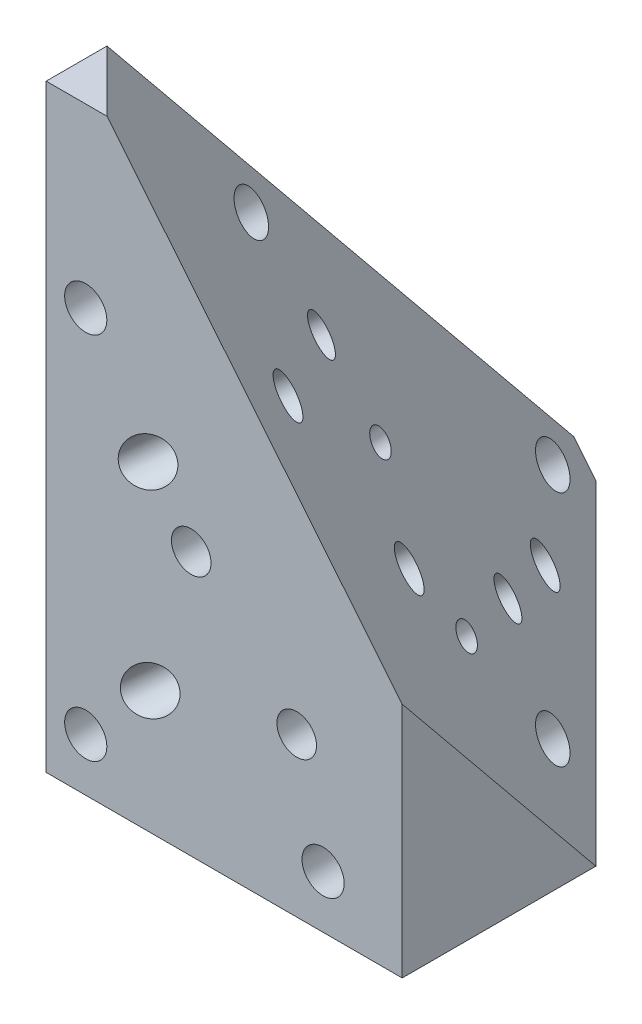
ISO-10303-21;
HEADER;
FILE_DESCRIPTION(('STEP AP214'),'2;1');
FILE_NAME('part.step','',(''),(''),'','','');
FILE_SCHEMA(('AUTOMOTIVE_DESIGN { 1 0 10303 214 1 1 1 1 }'));
ENDSEC;
DATA;
#1=APPLICATION_CONTEXT('core data for automotive mechanical design processes');
#2=APPLICATION_PROTOCOL_DEFINITION('international standard','automotive_design',2000,#1);
#3=PRODUCT_CONTEXT('',#1,'mechanical');
#4=PRODUCT('Part','Part','',(#3));
#5=PRODUCT_RELATED_PRODUCT_CATEGORY('part','',(#4));
#6=PRODUCT_DEFINITION_FORMATION('','',#4);
#7=PRODUCT_DEFINITION_CONTEXT('part definition',#1,'design');
#8=PRODUCT_DEFINITION('design','',#6,#7);
#9=PRODUCT_DEFINITION_SHAPE('','',#8);
#10=(LENGTH_UNIT() NAMED_UNIT(*) SI_UNIT(.MILLI.,.METRE.));
#11=(NAMED_UNIT(*) PLANE_ANGLE_UNIT() SI_UNIT($,.RADIAN.));
#12=(NAMED_UNIT(*) SI_UNIT($,.STERADIAN.) SOLID_ANGLE_UNIT());
#13=UNCERTAINTY_MEASURE_WITH_UNIT(LENGTH_MEASURE(1.E-05),#10,'distance_accuracy_value','');
#14=(GEOMETRIC_REPRESENTATION_CONTEXT(3) GLOBAL_UNCERTAINTY_ASSIGNED_CONTEXT((#13)) GLOBAL_UNIT_ASSIGNED_CONTEXT((#10,
#11,#12)) REPRESENTATION_CONTEXT('',''));
#15=CARTESIAN_POINT('',(0.,0.,0.));
#16=DIRECTION('',(0.,0.,1.));
#17=DIRECTION('',(1.,0.,0.));
#18=AXIS2_PLACEMENT_3D('',#15,#16,#17);
#19=CARTESIAN_POINT('',(13.5,22.7,0.));
#20=DIRECTION('',(0.,0.,-1.));
#21=DIRECTION('',(-1.,0.,0.));
#22=AXIS2_PLACEMENT_3D('',#19,#20,#21);
#23=PLANE('',#22);
#24=CARTESIAN_POINT('',(5.49999999999991,9.99999999999996,0.));
#25=DIRECTION('',(0.,0.,1.));
#26=DIRECTION('',(1.,0.,0.));
#27=AXIS2_PLACEMENT_3D('',#24,#25,#26);
#28=CIRCLE('',#27,0.749999999999989);
#29=CARTESIAN_POINT('',(6.2499999999999,9.99999999999996,0.));
#30=VERTEX_POINT('',#29);
#31=EDGE_CURVE('E155',#30,#30,#28,.T.);
#32=ORIENTED_EDGE('',*,*,#31,.F.);
#33=EDGE_LOOP('',(#32));
#34=FACE_BOUND('',#33,.T.);
#35=CARTESIAN_POINT('',(9.49999999999991,5.99999999999996,0.));
#36=DIRECTION('',(0.,0.,1.));
#37=DIRECTION('',(1.,0.,0.));
#38=AXIS2_PLACEMENT_3D('',#35,#36,#37);
#39=CIRCLE('',#38,0.749999999999989);
#40=CARTESIAN_POINT('',(10.2499999999999,5.99999999999996,0.));
#41=VERTEX_POINT('',#40);
#42=EDGE_CURVE('E133',#41,#41,#39,.T.);
#43=ORIENTED_EDGE('',*,*,#42,.F.);
#44=EDGE_LOOP('',(#43));
#45=FACE_BOUND('',#44,.T.);
#46=CARTESIAN_POINT('',(1.50000000000003,16.,0.));
#47=DIRECTION('',(0.,0.,1.));
#48=DIRECTION('',(1.,0.,0.));
#49=AXIS2_PLACEMENT_3D('',#46,#47,#48);
#50=CIRCLE('',#49,0.799999999999988);
#51=CARTESIAN_POINT('',(2.30000000000002,16.,0.));
#52=VERTEX_POINT('',#51);
#53=EDGE_CURVE('E120',#52,#52,#50,.T.);
#54=ORIENTED_EDGE('',*,*,#53,.F.);
#55=EDGE_LOOP('',(#54));
#56=FACE_BOUND('',#55,.T.);
#57=CARTESIAN_POINT('',(1.50000000000003,1.99999999999996,0.));
#58=DIRECTION('',(0.,0.,1.));
#59=DIRECTION('',(1.,0.,0.));
#60=AXIS2_PLACEMENT_3D('',#57,#58,#59);
#61=CIRCLE('',#60,0.799999999999988);
#62=CARTESIAN_POINT('',(2.30000000000002,1.99999999999996,0.));
#63=VERTEX_POINT('',#62);
#64=EDGE_CURVE('E119',#63,#63,#61,.T.);
#65=ORIENTED_EDGE('',*,*,#64,.F.);
#66=EDGE_LOOP('',(#65));
#67=FACE_BOUND('',#66,.T.);
#68=CARTESIAN_POINT('',(10.5,1.99999999999996,0.));
#69=DIRECTION('',(0.,0.,1.));
#70=DIRECTION('',(1.,0.,0.));
#71=AXIS2_PLACEMENT_3D('',#68,#69,#70);
#72=CIRCLE('',#71,0.799999999999988);
#73=CARTESIAN_POINT('',(11.3,1.99999999999996,0.));
#74=VERTEX_POINT('',#73);
#75=EDGE_CURVE('E171',#74,#74,#72,.T.);
#76=ORIENTED_EDGE('',*,*,#75,.F.);
#77=EDGE_LOOP('',(#76));
#78=FACE_BOUND('',#77,.T.);
#79=CARTESIAN_POINT('',(3.86275861430789,12.1280830884135,0.));
#80=DIRECTION('',(0.,0.,-1.));
#81=DIRECTION('',(0.774596669241479,0.632455532033681,0.));
#82=AXIS2_PLACEMENT_3D('',#79,#80,#81);
#83=ELLIPSE('',#82,1.30639452948435,0.799999999999993);
#84=CARTESIAN_POINT('',(4.87468746556176,12.9543195356044,0.));
#85=VERTEX_POINT('',#84);
#86=EDGE_CURVE('E180',#85,#85,#83,.T.);
#87=ORIENTED_EDGE('',*,*,#86,.T.);
#88=EDGE_LOOP('',(#87));
#89=FACE_BOUND('',#88,.T.);
#90=CARTESIAN_POINT('',(3.94544456856491,4.65658963492716,0.));
#91=DIRECTION('',(0.,0.,-1.));
#92=DIRECTION('',(0.774596669241479,0.632455532033681,0.));
#93=AXIS2_PLACEMENT_3D('',#90,#91,#92);
#94=ELLIPSE('',#93,1.30639452948435,0.799999999999992);
#95=CARTESIAN_POINT('',(4.95737341981878,5.48282608211808,0.));
#96=VERTEX_POINT('',#95);
#97=EDGE_CURVE('E186',#96,#96,#94,.T.);
#98=ORIENTED_EDGE('',*,*,#97,.T.);
#99=EDGE_LOOP('',(#98));
#100=FACE_BOUND('',#99,.T.);
#101=DIRECTION('',(0.,-1.,0.));
#102=VECTOR('',#101,1.);
#103=CARTESIAN_POINT('',(13.5,22.7,0.));
#104=LINE('',#103,#102);
#105=CARTESIAN_POINT('',(13.5,8.99101852486634,0.));
#106=VERTEX_POINT('',#105);
#107=CARTESIAN_POINT('',(13.5,0.,0.));
#108=VERTEX_POINT('',#107);
#109=EDGE_CURVE('E47',#106,#108,#104,.T.);
#110=ORIENTED_EDGE('',*,*,#109,.F.);
#111=DIRECTION('',(-0.632455532033681,0.774596669241479,0.));
#112=VECTOR('',#111,1.);
#113=CARTESIAN_POINT('',(6.78399809853108,17.2164074099464,0.));
#114=LINE('',#113,#112);
#115=CARTESIAN_POINT('',(2.30666349755168,22.7,0.));
#116=VERTEX_POINT('',#115);
#117=EDGE_CURVE('E193',#106,#116,#114,.T.);
#118=ORIENTED_EDGE('',*,*,#117,.T.);
#119=DIRECTION('',(1.,0.,0.));
#120=VECTOR('',#119,1.);
#121=CARTESIAN_POINT('',(13.5,22.7,0.));
#122=LINE('',#121,#120);
#123=CARTESIAN_POINT('',(0.,22.7,0.));
#124=VERTEX_POINT('',#123);
#125=EDGE_CURVE('E105',#124,#116,#122,.T.);
#126=ORIENTED_EDGE('',*,*,#125,.F.);
#127=DIRECTION('',(0.,-1.,0.));
#128=VECTOR('',#127,1.);
#129=CARTESIAN_POINT('',(0.,22.7,0.));
#130=LINE('',#129,#128);
#131=CARTESIAN_POINT('',(0.,0.,0.));
#132=VERTEX_POINT('',#131);
#133=EDGE_CURVE('E89',#124,#132,#130,.T.);
#134=ORIENTED_EDGE('',*,*,#133,.T.);
#135=DIRECTION('',(1.,0.,0.));
#136=VECTOR('',#135,1.);
#137=CARTESIAN_POINT('',(13.5,0.,0.));
#138=LINE('',#137,#136);
#139=EDGE_CURVE('E104',#132,#108,#138,.T.);
#140=ORIENTED_EDGE('',*,*,#139,.T.);
#141=EDGE_LOOP('',(#110,#118,#126,#134,#140));
#142=FACE_BOUND('',#141,.T.);
#143=ADVANCED_FACE('F39',(#34,#45,#56,#67,#78,#89,#100,#142),#23,.F.);
#144=CARTESIAN_POINT('',(13.5,22.7,-20.));
#145=DIRECTION('',(-1.,0.,0.));
#146=DIRECTION('',(0.,0.,1.));
#147=AXIS2_PLACEMENT_3D('',#144,#145,#146);
#148=PLANE('',#147);
#149=DIRECTION('',(0.,0.,-1.));
#150=VECTOR('',#149,1.);
#151=CARTESIAN_POINT('',(13.5,0.,-20.));
#152=LINE('',#151,#150);
#153=CARTESIAN_POINT('',(13.5,0.,-7.34113588461129));
#154=VERTEX_POINT('',#153);
#155=EDGE_CURVE('E98',#108,#154,#152,.T.);
#156=ORIENTED_EDGE('',*,*,#155,.T.);
#157=DIRECTION('',(0.,0.77459666924148,0.63245553203368));
#158=VECTOR('',#157,1.);
#159=CARTESIAN_POINT('',(13.5,7.41844843881372,-1.2839980985312));
#160=LINE('',#159,#158);
#161=EDGE_CURVE('E54',#154,#106,#160,.T.);
#162=ORIENTED_EDGE('',*,*,#161,.T.);
#163=ORIENTED_EDGE('',*,*,#109,.T.);
#164=EDGE_LOOP('',(#156,#162,#163));
#165=FACE_BOUND('',#164,.T.);
#166=ADVANCED_FACE('F202',(#165),#148,.F.);
#167=CARTESIAN_POINT('',(0.,22.7,-20.));
#168=DIRECTION('',(0.,0.,1.));
#169=DIRECTION('',(1.,0.,0.));
#170=AXIS2_PLACEMENT_3D('',#167,#168,#169);
#171=PLANE('',#170);
#172=DIRECTION('',(0.,-1.,0.));
#173=VECTOR('',#172,1.);
#174=CARTESIAN_POINT('',(0.,22.7,-20.));
#175=LINE('',#174,#173);
#176=CARTESIAN_POINT('',(0.,1.03017686082109,-20.));
#177=VERTEX_POINT('',#176);
#178=CARTESIAN_POINT('',(0.,0.,-20.));
#179=VERTEX_POINT('',#178);
#180=EDGE_CURVE('E78',#177,#179,#175,.T.);
#181=ORIENTED_EDGE('',*,*,#180,.F.);
#182=DIRECTION('',(0.632455532033681,-0.774596669241479,0.));
#183=VECTOR('',#182,1.);
#184=CARTESIAN_POINT('',(-10.6160019014689,14.0320707443283,-20.));
#185=LINE('',#184,#183);
#186=CARTESIAN_POINT('',(0.841135884611283,0.,-20.));
#187=VERTEX_POINT('',#186);
#188=EDGE_CURVE('E96',#177,#187,#185,.T.);
#189=ORIENTED_EDGE('',*,*,#188,.T.);
#190=DIRECTION('',(-1.,0.,0.));
#191=VECTOR('',#190,1.);
#192=CARTESIAN_POINT('',(0.,0.,-20.));
#193=LINE('',#192,#191);
#194=EDGE_CURVE('E92',#187,#179,#193,.T.);
#195=ORIENTED_EDGE('',*,*,#194,.T.);
#196=EDGE_LOOP('',(#181,#189,#195));
#197=FACE_BOUND('',#196,.T.);
#198=ADVANCED_FACE('F93',(#197),#171,.F.);
#199=CARTESIAN_POINT('',(0.,22.7,0.));
#200=DIRECTION('',(1.,0.,0.));
#201=DIRECTION('',(0.,0.,-1.));
#202=AXIS2_PLACEMENT_3D('',#199,#200,#201);
#203=PLANE('',#202);
#204=CARTESIAN_POINT('',(0.,9.80785732702183,-3.25126265847081));
#205=DIRECTION('',(1.,0.,0.));
#206=DIRECTION('',(0.,0.63245553203368,-0.77459666924148));
#207=AXIS2_PLACEMENT_3D('',#204,#205,#206);
#208=ELLIPSE('',#207,0.816496580927723,0.499999999999996);
#209=CARTESIAN_POINT('',(0.,10.3242551065162,-3.88371819050448));
#210=VERTEX_POINT('',#209);
#211=EDGE_CURVE('E137',#210,#210,#208,.T.);
#212=ORIENTED_EDGE('',*,*,#211,.T.);
#213=EDGE_LOOP('',(#212));
#214=FACE_BOUND('',#213,.T.);
#215=DIRECTION('',(0.,0.,1.));
#216=VECTOR('',#215,1.);
#217=CARTESIAN_POINT('',(0.,22.7,0.));
#218=LINE('',#217,#216);
#219=CARTESIAN_POINT('',(0.,22.7,-2.30666349755168));
#220=VERTEX_POINT('',#219);
#221=EDGE_CURVE('E63',#220,#124,#218,.T.);
#222=ORIENTED_EDGE('',*,*,#221,.F.);
#223=DIRECTION('',(0.,-0.77459666924148,-0.63245553203368));
#224=VECTOR('',#223,1.);
#225=CARTESIAN_POINT('',(0.,23.830029715461,-1.38399809853099));
#226=LINE('',#225,#224);
#227=EDGE_CURVE('E86',#220,#177,#226,.T.);
#228=ORIENTED_EDGE('',*,*,#227,.T.);
#229=ORIENTED_EDGE('',*,*,#180,.T.);
#230=DIRECTION('',(0.,0.,1.));
#231=VECTOR('',#230,1.);
#232=CARTESIAN_POINT('',(0.,0.,0.));
#233=LINE('',#232,#231);
#234=EDGE_CURVE('E82',#179,#132,#233,.T.);
#235=ORIENTED_EDGE('',*,*,#234,.T.);
#236=ORIENTED_EDGE('',*,*,#133,.F.);
#237=EDGE_LOOP('',(#222,#228,#229,#235,#236));
#238=FACE_BOUND('',#237,.T.);
#239=ADVANCED_FACE('F80',(#214,#238),#203,.F.);
#240=CARTESIAN_POINT('',(0.,22.7,0.));
#241=DIRECTION('',(0.,-1.,0.));
#242=DIRECTION('',(0.,0.,-1.));
#243=AXIS2_PLACEMENT_3D('',#240,#241,#242);
#244=PLANE('',#243);
#245=ORIENTED_EDGE('',*,*,#125,.T.);
#246=DIRECTION('',(-0.707106781186548,0.,-0.707106781186547));
#247=VECTOR('',#246,1.);
#248=CARTESIAN_POINT('',(1.15333174877584,22.7,-1.15333174877584));
#249=LINE('',#248,#247);
#250=EDGE_CURVE('E196',#116,#220,#249,.T.);
#251=ORIENTED_EDGE('',*,*,#250,.T.);
#252=ORIENTED_EDGE('',*,*,#221,.T.);
#253=EDGE_LOOP('',(#245,#251,#252));
#254=FACE_BOUND('',#253,.T.);
#255=ADVANCED_FACE('F224',(#254),#244,.F.);
#256=CARTESIAN_POINT('',(0.,0.,0.));
#257=DIRECTION('',(0.,-1.,0.));
#258=DIRECTION('',(0.,0.,-1.));
#259=AXIS2_PLACEMENT_3D('',#256,#257,#258);
#260=PLANE('',#259);
#261=CARTESIAN_POINT('',(2.13001266312057,0.,-5.38127532159136));
#262=DIRECTION('',(0.,-1.,0.));
#263=DIRECTION('',(0.707106781186547,0.,-0.707106781186548));
#264=AXIS2_PLACEMENT_3D('',#261,#262,#263);
#265=ELLIPSE('',#264,0.999999999999983,0.499999999999996);
#266=CARTESIAN_POINT('',(2.8371194443071,0.,-6.0883821027779));
#267=VERTEX_POINT('',#266);
#268=EDGE_CURVE('E142',#267,#267,#265,.T.);
#269=ORIENTED_EDGE('',*,*,#268,.F.);
#270=EDGE_LOOP('',(#269));
#271=FACE_BOUND('',#270,.T.);
#272=CARTESIAN_POINT('',(2.13001266312054,0.,-11.0381295710837));
#273=DIRECTION('',(0.,-1.,0.));
#274=DIRECTION('',(0.707106781186547,0.,-0.707106781186548));
#275=AXIS2_PLACEMENT_3D('',#272,#273,#274);
#276=ELLIPSE('',#275,1.59999999999997,0.799999999999993);
#277=CARTESIAN_POINT('',(3.26138351301899,0.,-12.1695004209822));
#278=VERTEX_POINT('',#277);
#279=EDGE_CURVE('E112',#278,#278,#276,.T.);
#280=ORIENTED_EDGE('',*,*,#279,.F.);
#281=EDGE_LOOP('',(#280));
#282=FACE_BOUND('',#281,.T.);
#283=DIRECTION('',(-0.707106781186548,0.,-0.707106781186547));
#284=VECTOR('',#283,1.);
#285=CARTESIAN_POINT('',(10.4205679423056,0.,-10.4205679423057));
#286=LINE('',#285,#284);
#287=EDGE_CURVE('E11',#154,#187,#286,.T.);
#288=ORIENTED_EDGE('',*,*,#287,.F.);
#289=ORIENTED_EDGE('',*,*,#155,.F.);
#290=ORIENTED_EDGE('',*,*,#139,.F.);
#291=ORIENTED_EDGE('',*,*,#234,.F.);
#292=ORIENTED_EDGE('',*,*,#194,.F.);
#293=EDGE_LOOP('',(#288,#289,#290,#291,#292));
#294=FACE_BOUND('',#293,.T.);
#295=ADVANCED_FACE('F101',(#271,#282,#294),#260,.T.);
#296=CARTESIAN_POINT('',(7.81542595672918,6.38126857216326,-7.81542595672919));
#297=DIRECTION('',(-0.612372435695792,-0.500000000000005,0.612372435695793));
#298=DIRECTION('',(0.707106781186548,0.,0.707106781186547));
#299=AXIS2_PLACEMENT_3D('',#296,#297,#298);
#300=PLANE('',#299);
#301=CARTESIAN_POINT('',(3.59317171965002,12.7416697508023,-6.84443437812084));
#302=DIRECTION('',(0.612372435695792,0.500000000000005,-0.612372435695793));
#303=DIRECTION('',(-0.707106781186548,0.,-0.707106781186547));
#304=AXIS2_PLACEMENT_3D('',#301,#302,#303);
#305=CIRCLE('',#304,0.749999999999988);
#306=CARTESIAN_POINT('',(3.06284163376012,12.7416697508023,-7.37476446401074));
#307=VERTEX_POINT('',#306);
#308=EDGE_CURVE('E323',#307,#307,#305,.T.);
#309=ORIENTED_EDGE('',*,*,#308,.F.);
#310=EDGE_LOOP('',(#309));
#311=FACE_BOUND('',#310,.T.);
#312=CARTESIAN_POINT('',(7.1287056255828,4.08141571295795,-10.3799682840536));
#313=DIRECTION('',(0.612372435695792,0.500000000000005,-0.612372435695793));
#314=DIRECTION('',(-0.707106781186548,0.,-0.707106781186547));
#315=AXIS2_PLACEMENT_3D('',#312,#313,#314);
#316=CIRCLE('',#315,0.749999999999989);
#317=CARTESIAN_POINT('',(6.5983755396929,4.08141571295795,-10.9102983699435));
#318=VERTEX_POINT('',#317);
#319=EDGE_CURVE('E145',#318,#318,#316,.T.);
#320=ORIENTED_EDGE('',*,*,#319,.F.);
#321=EDGE_LOOP('',(#320));
#322=FACE_BOUND('',#321,.T.);
#323=CARTESIAN_POINT('',(5.49999999999991,9.99999999999996,-7.17617007533406));
#324=DIRECTION('',(-0.612372435695792,-0.500000000000005,0.612372435695793));
#325=DIRECTION('',(0.474341649025253,0.387298334620744,0.790569415042096));
#326=AXIS2_PLACEMENT_3D('',#323,#324,#325);
#327=ELLIPSE('',#326,0.816496580927722,0.499999999999996);
#328=CARTESIAN_POINT('',(5.88729833462065,10.3162277660168,-6.53067285096616));
#329=VERTEX_POINT('',#328);
#330=EDGE_CURVE('E124',#329,#329,#327,.T.);
#331=ORIENTED_EDGE('',*,*,#330,.T.);
#332=EDGE_LOOP('',(#331));
#333=FACE_BOUND('',#332,.T.);
#334=CARTESIAN_POINT('',(9.49999999999991,5.99999999999996,-6.442156399045));
#335=DIRECTION('',(-0.612372435695792,-0.500000000000005,0.612372435695793));
#336=DIRECTION('',(0.474341649025253,0.387298334620744,0.790569415042096));
#337=AXIS2_PLACEMENT_3D('',#334,#335,#336);
#338=ELLIPSE('',#337,0.816496580927722,0.499999999999996);
#339=CARTESIAN_POINT('',(9.88729833462065,6.3162277660168,-5.7966591746771));
#340=VERTEX_POINT('',#339);
#341=EDGE_CURVE('E121',#340,#340,#338,.T.);
#342=ORIENTED_EDGE('',*,*,#341,.T.);
#343=EDGE_LOOP('',(#342));
#344=FACE_BOUND('',#343,.T.);
#345=CARTESIAN_POINT('',(1.50000000000003,16.,-6.27719058976751));
#346=DIRECTION('',(-0.612372435695792,-0.500000000000005,0.612372435695793));
#347=DIRECTION('',(0.474341649025253,0.387298334620744,0.790569415042096));
#348=AXIS2_PLACEMENT_3D('',#345,#346,#347);
#349=ELLIPSE('',#348,1.30639452948434,0.799999999999987);
#350=CARTESIAN_POINT('',(2.1196773353932,16.5059644256269,-5.24439503077888));
#351=VERTEX_POINT('',#350);
#352=EDGE_CURVE('E116',#351,#351,#349,.T.);
#353=ORIENTED_EDGE('',*,*,#352,.T.);
#354=EDGE_LOOP('',(#353));
#355=FACE_BOUND('',#354,.T.);
#356=CARTESIAN_POINT('',(1.50000000000003,1.99999999999996,-17.7081427227558));
#357=DIRECTION('',(-0.612372435695792,-0.500000000000005,0.612372435695793));
#358=DIRECTION('',(0.474341649025253,0.387298334620744,0.790569415042096));
#359=AXIS2_PLACEMENT_3D('',#356,#357,#358);
#360=ELLIPSE('',#359,1.30639452948434,0.799999999999987);
#361=CARTESIAN_POINT('',(2.1196773353932,2.5059644256269,-16.6753471637672));
#362=VERTEX_POINT('',#361);
#363=EDGE_CURVE('E168',#362,#362,#360,.T.);
#364=ORIENTED_EDGE('',*,*,#363,.T.);
#365=EDGE_LOOP('',(#364));
#366=FACE_BOUND('',#365,.T.);
#367=CARTESIAN_POINT('',(10.5,1.99999999999996,-8.70814272275583));
#368=DIRECTION('',(-0.612372435695792,-0.500000000000005,0.612372435695793));
#369=DIRECTION('',(0.474341649025253,0.387298334620744,0.790569415042096));
#370=AXIS2_PLACEMENT_3D('',#367,#368,#369);
#371=ELLIPSE('',#370,1.30639452948434,0.799999999999987);
#372=CARTESIAN_POINT('',(11.1196773353932,2.5059644256269,-7.67534716376719));
#373=VERTEX_POINT('',#372);
#374=EDGE_CURVE('E174',#373,#373,#371,.T.);
#375=ORIENTED_EDGE('',*,*,#374,.T.);
#376=EDGE_LOOP('',(#375));
#377=FACE_BOUND('',#376,.T.);
#378=CARTESIAN_POINT('',(6.51619820008524,14.294607437899,-2.65343958577735));
#379=DIRECTION('',(0.612372435695792,0.500000000000005,-0.612372435695793));
#380=DIRECTION('',(-0.707106781186548,0.,-0.707106781186547));
#381=AXIS2_PLACEMENT_3D('',#378,#379,#380);
#382=CIRCLE('',#381,0.799999999999988);
#383=CARTESIAN_POINT('',(5.95051277513601,14.294607437899,-3.21912501072658));
#384=VERTEX_POINT('',#383);
#385=EDGE_CURVE('E177',#384,#384,#382,.T.);
#386=ORIENTED_EDGE('',*,*,#385,.F.);
#387=EDGE_LOOP('',(#386));
#388=FACE_BOUND('',#387,.T.);
#389=CARTESIAN_POINT('',(8.85554524369419,8.66567004818119,-4.91010067512928));
#390=DIRECTION('',(0.612372435695792,0.500000000000005,-0.612372435695793));
#391=DIRECTION('',(-0.707106781186548,0.,-0.707106781186547));
#392=AXIS2_PLACEMENT_3D('',#389,#390,#391);
#393=CIRCLE('',#392,0.799999999999988);
#394=CARTESIAN_POINT('',(8.28985981874496,8.66567004818119,-5.47578610007851));
#395=VERTEX_POINT('',#394);
#396=EDGE_CURVE('E183',#395,#395,#393,.T.);
#397=ORIENTED_EDGE('',*,*,#396,.F.);
#398=EDGE_LOOP('',(#397));
#399=FACE_BOUND('',#398,.T.);
#400=CARTESIAN_POINT('',(5.00738528202316,2.34936490538908,-13.9155021899863));
#401=DIRECTION('',(0.612372435695792,0.500000000000005,-0.612372435695793));
#402=DIRECTION('',(-0.707106781186548,0.,-0.707106781186547));
#403=AXIS2_PLACEMENT_3D('',#400,#401,#402);
#404=CIRCLE('',#403,0.799999999999988);
#405=CARTESIAN_POINT('',(4.44169985707393,2.34936490538908,-14.4811876149356));
#406=VERTEX_POINT('',#405);
#407=EDGE_CURVE('E115',#406,#406,#404,.T.);
#408=ORIENTED_EDGE('',*,*,#407,.F.);
#409=EDGE_LOOP('',(#408));
#410=FACE_BOUND('',#409,.T.);
#411=ORIENTED_EDGE('',*,*,#250,.F.);
#412=ORIENTED_EDGE('',*,*,#117,.F.);
#413=ORIENTED_EDGE('',*,*,#161,.F.);
#414=ORIENTED_EDGE('',*,*,#287,.T.);
#415=ORIENTED_EDGE('',*,*,#188,.F.);
#416=ORIENTED_EDGE('',*,*,#227,.F.);
#417=EDGE_LOOP('',(#411,#412,#413,#414,#415,#416));
#418=FACE_BOUND('',#417,.T.);
#419=ADVANCED_FACE('F212',(#311,#322,#333,#344,#355,#366,#377,#388,#399,#410,#418),#300,.F.);
#420=CARTESIAN_POINT('',(5.00738528202316,2.34936490538907,-13.9155021899863));
#421=DIRECTION('',(0.612372435695792,0.500000000000005,-0.612372435695793));
#422=DIRECTION('',(-0.707106781186548,0.,-0.707106781186547));
#423=AXIS2_PLACEMENT_3D('',#420,#421,#422);
#424=CYLINDRICAL_SURFACE('',#423,0.799999999999993);
#425=ORIENTED_EDGE('',*,*,#279,.T.);
#426=EDGE_LOOP('',(#425));
#427=FACE_BOUND('',#426,.T.);
#428=ORIENTED_EDGE('',*,*,#407,.T.);
#429=EDGE_LOOP('',(#428));
#430=FACE_BOUND('',#429,.T.);
#431=ADVANCED_FACE('F214',(#427,#430),#424,.F.);
#432=CARTESIAN_POINT('',(8.85554524369419,8.66567004818119,-4.91010067512928));
#433=DIRECTION('',(0.612372435695792,0.500000000000005,-0.612372435695793));
#434=DIRECTION('',(-0.707106781186548,0.,-0.707106781186547));
#435=AXIS2_PLACEMENT_3D('',#432,#433,#434);
#436=CYLINDRICAL_SURFACE('',#435,0.799999999999992);
#437=ORIENTED_EDGE('',*,*,#396,.T.);
#438=EDGE_LOOP('',(#437));
#439=FACE_BOUND('',#438,.T.);
#440=ORIENTED_EDGE('',*,*,#97,.F.);
#441=EDGE_LOOP('',(#440));
#442=FACE_BOUND('',#441,.T.);
#443=ADVANCED_FACE('F221',(#439,#442),#436,.F.);
#444=CARTESIAN_POINT('',(6.51619820008524,14.294607437899,-2.65343958577735));
#445=DIRECTION('',(0.612372435695792,0.500000000000005,-0.612372435695793));
#446=DIRECTION('',(-0.707106781186548,0.,-0.707106781186547));
#447=AXIS2_PLACEMENT_3D('',#444,#445,#446);
#448=CYLINDRICAL_SURFACE('',#447,0.799999999999993);
#449=ORIENTED_EDGE('',*,*,#385,.T.);
#450=EDGE_LOOP('',(#449));
#451=FACE_BOUND('',#450,.T.);
#452=ORIENTED_EDGE('',*,*,#86,.F.);
#453=EDGE_LOOP('',(#452));
#454=FACE_BOUND('',#453,.T.);
#455=ADVANCED_FACE('F250',(#451,#454),#448,.F.);
#456=CARTESIAN_POINT('',(10.5,1.99999999999996,0.));
#457=DIRECTION('',(0.,0.,1.));
#458=DIRECTION('',(1.,0.,0.));
#459=AXIS2_PLACEMENT_3D('',#456,#457,#458);
#460=CYLINDRICAL_SURFACE('',#459,0.799999999999987);
#461=ORIENTED_EDGE('',*,*,#75,.T.);
#462=EDGE_LOOP('',(#461));
#463=FACE_BOUND('',#462,.T.);
#464=ORIENTED_EDGE('',*,*,#374,.F.);
#465=EDGE_LOOP('',(#464));
#466=FACE_BOUND('',#465,.T.);
#467=ADVANCED_FACE('F256',(#463,#466),#460,.F.);
#468=CARTESIAN_POINT('',(1.50000000000003,1.99999999999996,0.));
#469=DIRECTION('',(0.,0.,1.));
#470=DIRECTION('',(1.,0.,0.));
#471=AXIS2_PLACEMENT_3D('',#468,#469,#470);
#472=CYLINDRICAL_SURFACE('',#471,0.799999999999987);
#473=ORIENTED_EDGE('',*,*,#64,.T.);
#474=EDGE_LOOP('',(#473));
#475=FACE_BOUND('',#474,.T.);
#476=ORIENTED_EDGE('',*,*,#363,.F.);
#477=EDGE_LOOP('',(#476));
#478=FACE_BOUND('',#477,.T.);
#479=ADVANCED_FACE('F262',(#475,#478),#472,.F.);
#480=CARTESIAN_POINT('',(1.50000000000003,16.,0.));
#481=DIRECTION('',(0.,0.,1.));
#482=DIRECTION('',(1.,0.,0.));
#483=AXIS2_PLACEMENT_3D('',#480,#481,#482);
#484=CYLINDRICAL_SURFACE('',#483,0.799999999999987);
#485=ORIENTED_EDGE('',*,*,#53,.T.);
#486=EDGE_LOOP('',(#485));
#487=FACE_BOUND('',#486,.T.);
#488=ORIENTED_EDGE('',*,*,#352,.F.);
#489=EDGE_LOOP('',(#488));
#490=FACE_BOUND('',#489,.T.);
#491=ADVANCED_FACE('F266',(#487,#490),#484,.F.);
#492=CARTESIAN_POINT('',(9.49999999999991,5.99999999999996,0.));
#493=DIRECTION('',(0.,0.,1.));
#494=DIRECTION('',(1.,0.,0.));
#495=AXIS2_PLACEMENT_3D('',#492,#493,#494);
#496=CYLINDRICAL_SURFACE('',#495,0.499999999999996);
#497=CARTESIAN_POINT('',(9.49999999999991,5.99999999999996,-4.65021515475689));
#498=DIRECTION('',(0.,0.,1.));
#499=DIRECTION('',(1.,0.,0.));
#500=AXIS2_PLACEMENT_3D('',#497,#498,#499);
#501=CIRCLE('',#500,0.499999999999996);
#502=CARTESIAN_POINT('',(9.99999999999991,5.99999999999996,-4.65021515475689));
#503=VERTEX_POINT('',#502);
#504=EDGE_CURVE('E127',#503,#503,#501,.T.);
#505=ORIENTED_EDGE('',*,*,#504,.T.);
#506=EDGE_LOOP('',(#505));
#507=FACE_BOUND('',#506,.T.);
#508=ORIENTED_EDGE('',*,*,#341,.F.);
#509=EDGE_LOOP('',(#508));
#510=FACE_BOUND('',#509,.T.);
#511=ADVANCED_FACE('F270',(#507,#510),#496,.F.);
#512=CARTESIAN_POINT('',(5.49999999999991,9.99999999999996,0.));
#513=DIRECTION('',(0.,0.,1.));
#514=DIRECTION('',(1.,0.,0.));
#515=AXIS2_PLACEMENT_3D('',#512,#513,#514);
#516=CYLINDRICAL_SURFACE('',#515,0.499999999999996);
#517=CARTESIAN_POINT('',(5.49999999999991,9.99999999999996,-4.65021515475689));
#518=DIRECTION('',(0.,0.,1.));
#519=DIRECTION('',(1.,0.,0.));
#520=AXIS2_PLACEMENT_3D('',#517,#518,#519);
#521=CIRCLE('',#520,0.499999999999996);
#522=CARTESIAN_POINT('',(5.99999999999991,9.99999999999996,-4.65021515475689));
#523=VERTEX_POINT('',#522);
#524=EDGE_CURVE('E131',#523,#523,#521,.T.);
#525=ORIENTED_EDGE('',*,*,#524,.T.);
#526=EDGE_LOOP('',(#525));
#527=FACE_BOUND('',#526,.T.);
#528=ORIENTED_EDGE('',*,*,#330,.F.);
#529=EDGE_LOOP('',(#528));
#530=FACE_BOUND('',#529,.T.);
#531=ADVANCED_FACE('F274',(#527,#530),#516,.F.);
#532=CARTESIAN_POINT('',(9.49999999999991,5.99999999999996,-4.5));
#533=DIRECTION('',(0.,0.,1.));
#534=DIRECTION('',(1.,0.,0.));
#535=AXIS2_PLACEMENT_3D('',#532,#533,#534);
#536=CONICAL_SURFACE('',#535,0.749999999999999,1.02974425867665);
#537=CARTESIAN_POINT('',(9.49999999999991,5.99999999999996,-4.5));
#538=DIRECTION('',(0.,0.,1.));
#539=DIRECTION('',(1.,0.,0.));
#540=AXIS2_PLACEMENT_3D('',#537,#538,#539);
#541=CIRCLE('',#540,0.749999999999999);
#542=CARTESIAN_POINT('',(10.2499999999999,5.99999999999996,-4.5));
#543=VERTEX_POINT('',#542);
#544=EDGE_CURVE('E130',#543,#543,#541,.T.);
#545=ORIENTED_EDGE('',*,*,#544,.T.);
#546=EDGE_LOOP('',(#545));
#547=FACE_BOUND('',#546,.T.);
#548=ORIENTED_EDGE('',*,*,#504,.F.);
#549=EDGE_LOOP('',(#548));
#550=FACE_BOUND('',#549,.T.);
#551=ADVANCED_FACE('F278',(#547,#550),#536,.F.);
#552=CARTESIAN_POINT('',(9.49999999999991,5.99999999999996,0.));
#553=DIRECTION('',(0.,0.,1.));
#554=DIRECTION('',(1.,0.,0.));
#555=AXIS2_PLACEMENT_3D('',#552,#553,#554);
#556=CYLINDRICAL_SURFACE('',#555,0.749999999999994);
#557=ORIENTED_EDGE('',*,*,#544,.F.);
#558=EDGE_LOOP('',(#557));
#559=FACE_BOUND('',#558,.T.);
#560=ORIENTED_EDGE('',*,*,#42,.T.);
#561=EDGE_LOOP('',(#560));
#562=FACE_BOUND('',#561,.T.);
#563=ADVANCED_FACE('F282',(#559,#562),#556,.F.);
#564=CARTESIAN_POINT('',(5.49999999999991,9.99999999999996,-4.5));
#565=DIRECTION('',(0.,0.,1.));
#566=DIRECTION('',(1.,0.,0.));
#567=AXIS2_PLACEMENT_3D('',#564,#565,#566);
#568=CONICAL_SURFACE('',#567,0.749999999999999,1.02974425867665);
#569=CARTESIAN_POINT('',(5.49999999999991,9.99999999999996,-4.5));
#570=DIRECTION('',(0.,0.,1.));
#571=DIRECTION('',(1.,0.,0.));
#572=AXIS2_PLACEMENT_3D('',#569,#570,#571);
#573=CIRCLE('',#572,0.749999999999999);
#574=CARTESIAN_POINT('',(6.24999999999991,9.99999999999996,-4.5));
#575=VERTEX_POINT('',#574);
#576=EDGE_CURVE('E134',#575,#575,#573,.T.);
#577=ORIENTED_EDGE('',*,*,#576,.T.);
#578=EDGE_LOOP('',(#577));
#579=FACE_BOUND('',#578,.T.);
#580=ORIENTED_EDGE('',*,*,#524,.F.);
#581=EDGE_LOOP('',(#580));
#582=FACE_BOUND('',#581,.T.);
#583=ADVANCED_FACE('F286',(#579,#582),#568,.F.);
#584=CARTESIAN_POINT('',(5.49999999999991,9.99999999999996,0.));
#585=DIRECTION('',(0.,0.,1.));
#586=DIRECTION('',(1.,0.,0.));
#587=AXIS2_PLACEMENT_3D('',#584,#585,#586);
#588=CYLINDRICAL_SURFACE('',#587,0.749999999999994);
#589=ORIENTED_EDGE('',*,*,#576,.F.);
#590=EDGE_LOOP('',(#589));
#591=FACE_BOUND('',#590,.T.);
#592=ORIENTED_EDGE('',*,*,#31,.T.);
#593=EDGE_LOOP('',(#592));
#594=FACE_BOUND('',#593,.T.);
#595=ADVANCED_FACE('F290',(#591,#594),#588,.F.);
#596=CARTESIAN_POINT('',(7.1287056255828,4.08141571295795,-10.3799682840536));
#597=DIRECTION('',(0.612372435695792,0.500000000000005,-0.612372435695793));
#598=DIRECTION('',(-0.707106781186548,0.,-0.707106781186547));
#599=AXIS2_PLACEMENT_3D('',#596,#597,#598);
#600=CYLINDRICAL_SURFACE('',#599,0.499999999999996);
#601=CARTESIAN_POINT('',(4.89341448045063,2.25630813557949,-8.14467713892142));
#602=DIRECTION('',(0.612372435695792,0.500000000000005,-0.612372435695793));
#603=DIRECTION('',(-0.707106781186548,0.,-0.707106781186547));
#604=AXIS2_PLACEMENT_3D('',#601,#602,#603);
#605=CIRCLE('',#604,0.499999999999996);
#606=CARTESIAN_POINT('',(4.53986108985736,2.25630813557949,-8.49823052951469));
#607=VERTEX_POINT('',#606);
#608=EDGE_CURVE('E135',#607,#607,#605,.T.);
#609=ORIENTED_EDGE('',*,*,#608,.T.);
#610=EDGE_LOOP('',(#609));
#611=FACE_BOUND('',#610,.T.);
#612=ORIENTED_EDGE('',*,*,#268,.T.);
#613=EDGE_LOOP('',(#612));
#614=FACE_BOUND('',#613,.T.);
#615=ADVANCED_FACE('F294',(#611,#614),#600,.F.);
#616=CARTESIAN_POINT('',(3.59317171965002,12.7416697508023,-6.84443437812084));
#617=DIRECTION('',(0.612372435695792,0.500000000000005,-0.612372435695793));
#618=DIRECTION('',(-0.707106781186548,0.,-0.707106781186547));
#619=AXIS2_PLACEMENT_3D('',#616,#617,#618);
#620=CYLINDRICAL_SURFACE('',#619,0.499999999999996);
#621=CARTESIAN_POINT('',(1.35788057451785,10.9165621734238,-4.60914323298866));
#622=DIRECTION('',(0.612372435695792,0.500000000000005,-0.612372435695793));
#623=DIRECTION('',(-0.707106781186548,0.,-0.707106781186547));
#624=AXIS2_PLACEMENT_3D('',#621,#622,#623);
#625=CIRCLE('',#624,0.499999999999996);
#626=CARTESIAN_POINT('',(1.00432718392457,10.9165621734238,-4.96269662358193));
#627=VERTEX_POINT('',#626);
#628=EDGE_CURVE('E42',#627,#627,#625,.T.);
#629=ORIENTED_EDGE('',*,*,#628,.T.);
#630=EDGE_LOOP('',(#629));
#631=FACE_BOUND('',#630,.T.);
#632=ORIENTED_EDGE('',*,*,#211,.F.);
#633=EDGE_LOOP('',(#632));
#634=FACE_BOUND('',#633,.T.);
#635=ADVANCED_FACE('F298',(#631,#634),#620,.F.);
#636=CARTESIAN_POINT('',(4.98540210064752,2.33141571295793,-8.23666475911832));
#637=DIRECTION('',(0.612372435695792,0.500000000000005,-0.612372435695793));
#638=DIRECTION('',(-0.707106781186548,0.,-0.707106781186547));
#639=AXIS2_PLACEMENT_3D('',#636,#637,#638);
#640=CONICAL_SURFACE('',#639,0.749999999999998,1.02974425867665);
#641=CARTESIAN_POINT('',(4.98540210064752,2.33141571295793,-8.23666475911832));
#642=DIRECTION('',(0.612372435695792,0.500000000000005,-0.612372435695793));
#643=DIRECTION('',(-0.707106781186548,0.,-0.707106781186547));
#644=AXIS2_PLACEMENT_3D('',#641,#642,#643);
#645=CIRCLE('',#644,0.749999999999998);
#646=CARTESIAN_POINT('',(4.45507201475761,2.33141571295793,-8.76699484500823));
#647=VERTEX_POINT('',#646);
#648=EDGE_CURVE('E138',#647,#647,#645,.T.);
#649=ORIENTED_EDGE('',*,*,#648,.T.);
#650=EDGE_LOOP('',(#649));
#651=FACE_BOUND('',#650,.T.);
#652=ORIENTED_EDGE('',*,*,#608,.F.);
#653=EDGE_LOOP('',(#652));
#654=FACE_BOUND('',#653,.T.);
#655=ADVANCED_FACE('F301',(#651,#654),#640,.F.);
#656=CARTESIAN_POINT('',(7.1287056255828,4.08141571295795,-10.3799682840536));
#657=DIRECTION('',(0.612372435695792,0.500000000000005,-0.612372435695793));
#658=DIRECTION('',(-0.707106781186548,0.,-0.707106781186547));
#659=AXIS2_PLACEMENT_3D('',#656,#657,#658);
#660=CYLINDRICAL_SURFACE('',#659,0.749999999999994);
#661=ORIENTED_EDGE('',*,*,#648,.F.);
#662=EDGE_LOOP('',(#661));
#663=FACE_BOUND('',#662,.T.);
#664=ORIENTED_EDGE('',*,*,#319,.T.);
#665=EDGE_LOOP('',(#664));
#666=FACE_BOUND('',#665,.T.);
#667=ADVANCED_FACE('F305',(#663,#666),#660,.F.);
#668=CARTESIAN_POINT('',(1.44986819471474,10.9916697508023,-4.70113085318556));
#669=DIRECTION('',(0.612372435695792,0.500000000000005,-0.612372435695793));
#670=DIRECTION('',(-0.707106781186548,0.,-0.707106781186547));
#671=AXIS2_PLACEMENT_3D('',#668,#669,#670);
#672=CONICAL_SURFACE('',#671,0.749999999999998,1.02974425867665);
#673=CARTESIAN_POINT('',(1.44986819471474,10.9916697508023,-4.70113085318556));
#674=DIRECTION('',(0.612372435695792,0.500000000000005,-0.612372435695793));
#675=DIRECTION('',(-0.707106781186548,0.,-0.707106781186547));
#676=AXIS2_PLACEMENT_3D('',#673,#674,#675);
#677=CIRCLE('',#676,0.749999999999998);
#678=CARTESIAN_POINT('',(0.919538108824834,10.9916697508023,-5.23146093907547));
#679=VERTEX_POINT('',#678);
#680=EDGE_CURVE('E321',#679,#679,#677,.T.);
#681=ORIENTED_EDGE('',*,*,#680,.T.);
#682=EDGE_LOOP('',(#681));
#683=FACE_BOUND('',#682,.T.);
#684=ORIENTED_EDGE('',*,*,#628,.F.);
#685=EDGE_LOOP('',(#684));
#686=FACE_BOUND('',#685,.T.);
#687=ADVANCED_FACE('F308',(#683,#686),#672,.F.);
#688=CARTESIAN_POINT('',(3.59317171965002,12.7416697508023,-6.84443437812084));
#689=DIRECTION('',(0.612372435695792,0.500000000000005,-0.612372435695793));
#690=DIRECTION('',(-0.707106781186548,0.,-0.707106781186547));
#691=AXIS2_PLACEMENT_3D('',#688,#689,#690);
#692=CYLINDRICAL_SURFACE('',#691,0.749999999999993);
#693=ORIENTED_EDGE('',*,*,#680,.F.);
#694=EDGE_LOOP('',(#693));
#695=FACE_BOUND('',#694,.T.);
#696=ORIENTED_EDGE('',*,*,#308,.T.);
#697=EDGE_LOOP('',(#696));
#698=FACE_BOUND('',#697,.T.);
#699=ADVANCED_FACE('F312',(#695,#698),#692,.F.);
#700=CLOSED_SHELL('',(#143,#166,#198,#239,#255,#295,#419,#431,#443,#455,#467,#479,#491,#511,
#531,#551,#563,#583,#595,#615,#635,#655,#667,#687,#699));
#701=MANIFOLD_SOLID_BREP('B2',#700);
#702=ADVANCED_BREP_SHAPE_REPRESENTATION('',(#18,#701),#14);
#703=SHAPE_DEFINITION_REPRESENTATION(#9,#702);
ENDSEC;
END-ISO-10303-21;
